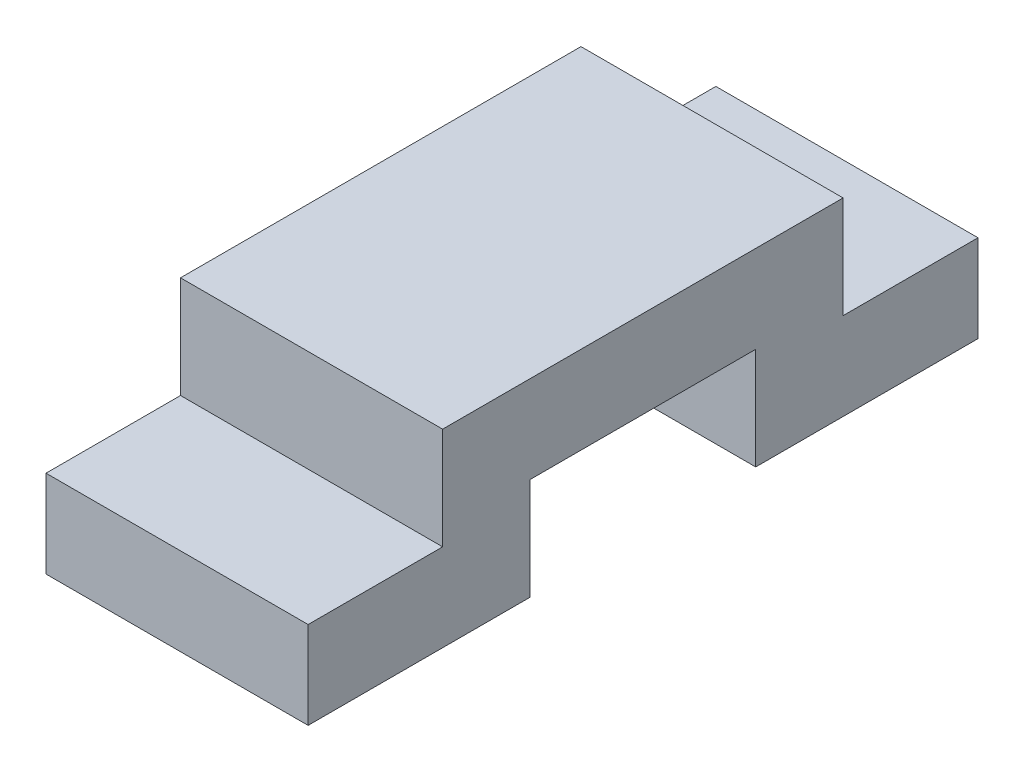
ISO-10303-21;
HEADER;
FILE_DESCRIPTION(('STEP AP214'),'2;1');
FILE_NAME('part.step','',(''),(''),'','','');
FILE_SCHEMA(('AUTOMOTIVE_DESIGN { 1 0 10303 214 1 1 1 1 }'));
ENDSEC;
DATA;
#1=APPLICATION_CONTEXT('core data for automotive mechanical design processes');
#2=APPLICATION_PROTOCOL_DEFINITION('international standard','automotive_design',2000,#1);
#3=PRODUCT_CONTEXT('',#1,'mechanical');
#4=PRODUCT('Part','Part','',(#3));
#5=PRODUCT_RELATED_PRODUCT_CATEGORY('part','',(#4));
#6=PRODUCT_DEFINITION_FORMATION('','',#4);
#7=PRODUCT_DEFINITION_CONTEXT('part definition',#1,'design');
#8=PRODUCT_DEFINITION('design','',#6,#7);
#9=PRODUCT_DEFINITION_SHAPE('','',#8);
#10=(LENGTH_UNIT() NAMED_UNIT(*) SI_UNIT(.MILLI.,.METRE.));
#11=(NAMED_UNIT(*) PLANE_ANGLE_UNIT() SI_UNIT($,.RADIAN.));
#12=(NAMED_UNIT(*) SI_UNIT($,.STERADIAN.) SOLID_ANGLE_UNIT());
#13=UNCERTAINTY_MEASURE_WITH_UNIT(LENGTH_MEASURE(1.E-05),#10,'distance_accuracy_value','');
#14=(GEOMETRIC_REPRESENTATION_CONTEXT(3) GLOBAL_UNCERTAINTY_ASSIGNED_CONTEXT((#13)) GLOBAL_UNIT_ASSIGNED_CONTEXT((#10,
#11,#12)) REPRESENTATION_CONTEXT('',''));
#15=CARTESIAN_POINT('',(0.,0.,0.));
#16=DIRECTION('',(0.,0.,1.));
#17=DIRECTION('',(1.,0.,0.));
#18=AXIS2_PLACEMENT_3D('',#15,#16,#17);
#19=CARTESIAN_POINT('',(0.,0.,0.));
#20=DIRECTION('',(0.,-1.,0.));
#21=DIRECTION('',(0.,0.,-1.));
#22=AXIS2_PLACEMENT_3D('',#19,#20,#21);
#23=PLANE('',#22);
#24=DIRECTION('',(0.,0.,-1.));
#25=VECTOR('',#24,1.);
#26=CARTESIAN_POINT('',(9.,0.,-0.2211828319911));
#27=LINE('',#26,#25);
#28=CARTESIAN_POINT('',(9.,0.,-15.5895922301704));
#29=VERTEX_POINT('',#28);
#30=CARTESIAN_POINT('',(9.,0.,-23.2211828319911));
#31=VERTEX_POINT('',#30);
#32=EDGE_CURVE('E232',#29,#31,#27,.T.);
#33=ORIENTED_EDGE('',*,*,#32,.F.);
#34=DIRECTION('',(-1.,0.,0.));
#35=VECTOR('',#34,1.);
#36=CARTESIAN_POINT('',(0.,0.,-15.5895922301704));
#37=LINE('',#36,#35);
#38=CARTESIAN_POINT('',(0.,0.,-15.5895922301704));
#39=VERTEX_POINT('',#38);
#40=EDGE_CURVE('E76',#29,#39,#37,.T.);
#41=ORIENTED_EDGE('',*,*,#40,.T.);
#42=DIRECTION('',(0.,0.,1.));
#43=VECTOR('',#42,1.);
#44=CARTESIAN_POINT('',(0.,0.,-0.2211828319911));
#45=LINE('',#44,#43);
#46=CARTESIAN_POINT('',(0.,0.,-23.2211828319911));
#47=VERTEX_POINT('',#46);
#48=EDGE_CURVE('E226',#47,#39,#45,.T.);
#49=ORIENTED_EDGE('',*,*,#48,.F.);
#50=DIRECTION('',(-1.,0.,0.));
#51=VECTOR('',#50,1.);
#52=CARTESIAN_POINT('',(0.,0.,-23.2211828319911));
#53=LINE('',#52,#51);
#54=EDGE_CURVE('E234',#31,#47,#53,.T.);
#55=ORIENTED_EDGE('',*,*,#54,.F.);
#56=EDGE_LOOP('',(#33,#41,#49,#55));
#57=FACE_BOUND('',#56,.T.);
#58=ADVANCED_FACE('F68',(#57),#23,.T.);
#59=CARTESIAN_POINT('',(0.,15.,-0.2211828319911));
#60=DIRECTION('',(1.,0.,0.));
#61=DIRECTION('',(0.,0.,-1.));
#62=AXIS2_PLACEMENT_3D('',#59,#60,#61);
#63=PLANE('',#62);
#64=DIRECTION('',(0.,0.,-1.));
#65=VECTOR('',#64,1.);
#66=CARTESIAN_POINT('',(0.,3.49999999999986,-0.2211828319911));
#67=LINE('',#66,#65);
#68=CARTESIAN_POINT('',(0.,3.49999999999986,-7.83959223017038));
#69=VERTEX_POINT('',#68);
#70=CARTESIAN_POINT('',(0.,3.49999999999986,-15.5895922301704));
#71=VERTEX_POINT('',#70);
#72=EDGE_CURVE('E185',#69,#71,#67,.T.);
#73=ORIENTED_EDGE('',*,*,#72,.F.);
#74=DIRECTION('',(0.,-1.,0.));
#75=VECTOR('',#74,1.);
#76=CARTESIAN_POINT('',(0.,15.,-7.83959223017038));
#77=LINE('',#76,#75);
#78=CARTESIAN_POINT('',(0.,0.,-7.83959223017038));
#79=VERTEX_POINT('',#78);
#80=EDGE_CURVE('E163',#69,#79,#77,.T.);
#81=ORIENTED_EDGE('',*,*,#80,.T.);
#82=CARTESIAN_POINT('',(0.,0.,-0.2211828319911));
#83=VERTEX_POINT('',#82);
#84=EDGE_CURVE('E225',#79,#83,#45,.T.);
#85=ORIENTED_EDGE('',*,*,#84,.T.);
#86=DIRECTION('',(0.,-1.,0.));
#87=VECTOR('',#86,1.);
#88=CARTESIAN_POINT('',(0.,15.,-0.2211828319911));
#89=LINE('',#88,#87);
#90=CARTESIAN_POINT('',(0.,2.99999999999999,-0.2211828319911));
#91=VERTEX_POINT('',#90);
#92=EDGE_CURVE('E244',#91,#83,#89,.T.);
#93=ORIENTED_EDGE('',*,*,#92,.F.);
#94=DIRECTION('',(0.,0.,-1.));
#95=VECTOR('',#94,1.);
#96=CARTESIAN_POINT('',(0.,2.99999999999999,-0.2211828319911));
#97=LINE('',#96,#95);
#98=CARTESIAN_POINT('',(0.,2.99999999999999,-4.83959223017038));
#99=VERTEX_POINT('',#98);
#100=EDGE_CURVE('E214',#91,#99,#97,.T.);
#101=ORIENTED_EDGE('',*,*,#100,.T.);
#102=DIRECTION('',(0.,1.,0.));
#103=VECTOR('',#102,1.);
#104=CARTESIAN_POINT('',(0.,15.,-4.83959223017038));
#105=LINE('',#104,#103);
#106=CARTESIAN_POINT('',(0.,6.49999999999986,-4.83959223017038));
#107=VERTEX_POINT('',#106);
#108=EDGE_CURVE('E217',#99,#107,#105,.T.);
#109=ORIENTED_EDGE('',*,*,#108,.T.);
#110=DIRECTION('',(0.,0.,-1.));
#111=VECTOR('',#110,1.);
#112=CARTESIAN_POINT('',(0.,6.49999999999986,-0.2211828319911));
#113=LINE('',#112,#111);
#114=CARTESIAN_POINT('',(0.,6.49999999999986,-18.5895922301704));
#115=VERTEX_POINT('',#114);
#116=EDGE_CURVE('E220',#107,#115,#113,.T.);
#117=ORIENTED_EDGE('',*,*,#116,.T.);
#118=DIRECTION('',(0.,1.,0.));
#119=VECTOR('',#118,1.);
#120=CARTESIAN_POINT('',(0.,15.,-18.5895922301704));
#121=LINE('',#120,#119);
#122=CARTESIAN_POINT('',(0.,2.99999999999999,-18.5895922301704));
#123=VERTEX_POINT('',#122);
#124=EDGE_CURVE('E223',#123,#115,#121,.T.);
#125=ORIENTED_EDGE('',*,*,#124,.F.);
#126=DIRECTION('',(0.,0.,-1.));
#127=VECTOR('',#126,1.);
#128=CARTESIAN_POINT('',(0.,2.99999999999999,-0.2211828319911));
#129=LINE('',#128,#127);
#130=CARTESIAN_POINT('',(0.,2.99999999999999,-23.2211828319911));
#131=VERTEX_POINT('',#130);
#132=EDGE_CURVE('E201',#123,#131,#129,.T.);
#133=ORIENTED_EDGE('',*,*,#132,.T.);
#134=DIRECTION('',(0.,-1.,0.));
#135=VECTOR('',#134,1.);
#136=CARTESIAN_POINT('',(0.,15.,-23.2211828319911));
#137=LINE('',#136,#135);
#138=EDGE_CURVE('E237',#131,#47,#137,.T.);
#139=ORIENTED_EDGE('',*,*,#138,.T.);
#140=ORIENTED_EDGE('',*,*,#48,.T.);
#141=DIRECTION('',(0.,-1.,0.));
#142=VECTOR('',#141,1.);
#143=CARTESIAN_POINT('',(0.,15.,-15.5895922301704));
#144=LINE('',#143,#142);
#145=EDGE_CURVE('E83',#71,#39,#144,.T.);
#146=ORIENTED_EDGE('',*,*,#145,.F.);
#147=EDGE_LOOP('',(#73,#81,#85,#93,#101,#109,#117,#125,#133,#139,#140,#146));
#148=FACE_BOUND('',#147,.T.);
#149=ADVANCED_FACE('F70',(#148),#63,.F.);
#150=CARTESIAN_POINT('',(0.,15.,-0.2211828319911));
#151=DIRECTION('',(0.,0.,-1.));
#152=DIRECTION('',(-1.,0.,0.));
#153=AXIS2_PLACEMENT_3D('',#150,#151,#152);
#154=PLANE('',#153);
#155=DIRECTION('',(0.,-1.,0.));
#156=VECTOR('',#155,1.);
#157=CARTESIAN_POINT('',(9.,15.,-0.2211828319911));
#158=LINE('',#157,#156);
#159=CARTESIAN_POINT('',(9.,2.99999999999999,-0.2211828319911));
#160=VERTEX_POINT('',#159);
#161=CARTESIAN_POINT('',(9.,0.,-0.2211828319911));
#162=VERTEX_POINT('',#161);
#163=EDGE_CURVE('E242',#160,#162,#158,.T.);
#164=ORIENTED_EDGE('',*,*,#163,.F.);
#165=DIRECTION('',(1.,0.,0.));
#166=VECTOR('',#165,1.);
#167=CARTESIAN_POINT('',(-6.,2.99999999999999,-0.2211828319911));
#168=LINE('',#167,#166);
#169=EDGE_CURVE('E210',#91,#160,#168,.T.);
#170=ORIENTED_EDGE('',*,*,#169,.F.);
#171=ORIENTED_EDGE('',*,*,#92,.T.);
#172=DIRECTION('',(1.,0.,0.));
#173=VECTOR('',#172,1.);
#174=CARTESIAN_POINT('',(0.,0.,-0.2211828319911));
#175=LINE('',#174,#173);
#176=EDGE_CURVE('E229',#83,#162,#175,.T.);
#177=ORIENTED_EDGE('',*,*,#176,.T.);
#178=EDGE_LOOP('',(#164,#170,#171,#177));
#179=FACE_BOUND('',#178,.T.);
#180=ADVANCED_FACE('F271',(#179),#154,.F.);
#181=CARTESIAN_POINT('',(9.,15.,-0.2211828319911));
#182=DIRECTION('',(-1.,0.,0.));
#183=DIRECTION('',(0.,0.,1.));
#184=AXIS2_PLACEMENT_3D('',#181,#182,#183);
#185=PLANE('',#184);
#186=CARTESIAN_POINT('',(9.,0.,-7.83959223017038));
#187=VERTEX_POINT('',#186);
#188=EDGE_CURVE('E179',#162,#187,#27,.T.);
#189=ORIENTED_EDGE('',*,*,#188,.T.);
#190=DIRECTION('',(0.,-1.,0.));
#191=VECTOR('',#190,1.);
#192=CARTESIAN_POINT('',(9.,3.49999999999986,-7.83959223017038));
#193=LINE('',#192,#191);
#194=CARTESIAN_POINT('',(9.,3.49999999999986,-7.83959223017038));
#195=VERTEX_POINT('',#194);
#196=EDGE_CURVE('E160',#195,#187,#193,.T.);
#197=ORIENTED_EDGE('',*,*,#196,.F.);
#198=DIRECTION('',(0.,0.,-1.));
#199=VECTOR('',#198,1.);
#200=CARTESIAN_POINT('',(9.,3.49999999999986,-7.83959223017038));
#201=LINE('',#200,#199);
#202=CARTESIAN_POINT('',(9.,3.49999999999986,-15.5895922301704));
#203=VERTEX_POINT('',#202);
#204=EDGE_CURVE('E169',#195,#203,#201,.T.);
#205=ORIENTED_EDGE('',*,*,#204,.T.);
#206=DIRECTION('',(0.,-1.,0.));
#207=VECTOR('',#206,1.);
#208=CARTESIAN_POINT('',(9.,3.49999999999986,-15.5895922301704));
#209=LINE('',#208,#207);
#210=EDGE_CURVE('E174',#203,#29,#209,.T.);
#211=ORIENTED_EDGE('',*,*,#210,.T.);
#212=ORIENTED_EDGE('',*,*,#32,.T.);
#213=DIRECTION('',(0.,-1.,0.));
#214=VECTOR('',#213,1.);
#215=CARTESIAN_POINT('',(9.,15.,-23.2211828319911));
#216=LINE('',#215,#214);
#217=CARTESIAN_POINT('',(9.,2.99999999999999,-23.2211828319911));
#218=VERTEX_POINT('',#217);
#219=EDGE_CURVE('E239',#218,#31,#216,.T.);
#220=ORIENTED_EDGE('',*,*,#219,.F.);
#221=DIRECTION('',(0.,0.,-1.));
#222=VECTOR('',#221,1.);
#223=CARTESIAN_POINT('',(9.,2.99999999999999,0.));
#224=LINE('',#223,#222);
#225=CARTESIAN_POINT('',(9.,2.99999999999999,-18.5895922301704));
#226=VERTEX_POINT('',#225);
#227=EDGE_CURVE('E91',#226,#218,#224,.T.);
#228=ORIENTED_EDGE('',*,*,#227,.F.);
#229=DIRECTION('',(0.,1.,0.));
#230=VECTOR('',#229,1.);
#231=CARTESIAN_POINT('',(9.,0.,-18.5895922301704));
#232=LINE('',#231,#230);
#233=CARTESIAN_POINT('',(9.,6.49999999999986,-18.5895922301704));
#234=VERTEX_POINT('',#233);
#235=EDGE_CURVE('E196',#226,#234,#232,.T.);
#236=ORIENTED_EDGE('',*,*,#235,.T.);
#237=DIRECTION('',(0.,0.,-1.));
#238=VECTOR('',#237,1.);
#239=CARTESIAN_POINT('',(9.,6.49999999999986,0.));
#240=LINE('',#239,#238);
#241=CARTESIAN_POINT('',(9.,6.49999999999986,-4.83959223017038));
#242=VERTEX_POINT('',#241);
#243=EDGE_CURVE('E193',#242,#234,#240,.T.);
#244=ORIENTED_EDGE('',*,*,#243,.F.);
#245=DIRECTION('',(0.,1.,0.));
#246=VECTOR('',#245,1.);
#247=CARTESIAN_POINT('',(9.,0.,-4.83959223017038));
#248=LINE('',#247,#246);
#249=CARTESIAN_POINT('',(9.,2.99999999999999,-4.83959223017038));
#250=VERTEX_POINT('',#249);
#251=EDGE_CURVE('E190',#250,#242,#248,.T.);
#252=ORIENTED_EDGE('',*,*,#251,.F.);
#253=EDGE_CURVE('E187',#160,#250,#224,.T.);
#254=ORIENTED_EDGE('',*,*,#253,.F.);
#255=ORIENTED_EDGE('',*,*,#163,.T.);
#256=EDGE_LOOP('',(#189,#197,#205,#211,#212,#220,#228,#236,#244,#252,#254,#255));
#257=FACE_BOUND('',#256,.T.);
#258=ADVANCED_FACE('F177',(#257),#185,.F.);
#259=CARTESIAN_POINT('',(0.,15.,-23.2211828319911));
#260=DIRECTION('',(0.,0.,1.));
#261=DIRECTION('',(1.,0.,0.));
#262=AXIS2_PLACEMENT_3D('',#259,#260,#261);
#263=PLANE('',#262);
#264=ORIENTED_EDGE('',*,*,#138,.F.);
#265=DIRECTION('',(1.,0.,0.));
#266=VECTOR('',#265,1.);
#267=CARTESIAN_POINT('',(-6.,2.99999999999999,-23.2211828319911));
#268=LINE('',#267,#266);
#269=EDGE_CURVE('E199',#131,#218,#268,.T.);
#270=ORIENTED_EDGE('',*,*,#269,.T.);
#271=ORIENTED_EDGE('',*,*,#219,.T.);
#272=ORIENTED_EDGE('',*,*,#54,.T.);
#273=EDGE_LOOP('',(#264,#270,#271,#272));
#274=FACE_BOUND('',#273,.T.);
#275=ADVANCED_FACE('F254',(#274),#263,.F.);
#276=DIRECTION('',(-1.,0.,0.));
#277=VECTOR('',#276,1.);
#278=CARTESIAN_POINT('',(0.,0.,-7.83959223017038));
#279=LINE('',#278,#277);
#280=EDGE_CURVE('E12',#187,#79,#279,.T.);
#281=ORIENTED_EDGE('',*,*,#280,.F.);
#282=ORIENTED_EDGE('',*,*,#188,.F.);
#283=ORIENTED_EDGE('',*,*,#176,.F.);
#284=ORIENTED_EDGE('',*,*,#84,.F.);
#285=EDGE_LOOP('',(#281,#282,#283,#284));
#286=FACE_BOUND('',#285,.T.);
#287=ADVANCED_FACE('F267',(#286),#23,.T.);
#288=CARTESIAN_POINT('',(-6.,0.,-18.5895922301704));
#289=DIRECTION('',(0.,0.,-1.));
#290=DIRECTION('',(-1.,0.,0.));
#291=AXIS2_PLACEMENT_3D('',#288,#289,#290);
#292=PLANE('',#291);
#293=ORIENTED_EDGE('',*,*,#124,.T.);
#294=DIRECTION('',(1.,0.,0.));
#295=VECTOR('',#294,1.);
#296=CARTESIAN_POINT('',(-6.,6.49999999999986,-18.5895922301704));
#297=LINE('',#296,#295);
#298=EDGE_CURVE('E204',#115,#234,#297,.T.);
#299=ORIENTED_EDGE('',*,*,#298,.T.);
#300=ORIENTED_EDGE('',*,*,#235,.F.);
#301=DIRECTION('',(1.,0.,0.));
#302=VECTOR('',#301,1.);
#303=CARTESIAN_POINT('',(-6.,2.99999999999999,-18.5895922301704));
#304=LINE('',#303,#302);
#305=EDGE_CURVE('E202',#123,#226,#304,.T.);
#306=ORIENTED_EDGE('',*,*,#305,.F.);
#307=EDGE_LOOP('',(#293,#299,#300,#306));
#308=FACE_BOUND('',#307,.T.);
#309=ADVANCED_FACE('F275',(#308),#292,.T.);
#310=CARTESIAN_POINT('',(-6.,6.49999999999986,0.));
#311=DIRECTION('',(0.,-1.,0.));
#312=DIRECTION('',(0.,0.,-1.));
#313=AXIS2_PLACEMENT_3D('',#310,#311,#312);
#314=PLANE('',#313);
#315=DIRECTION('',(1.,0.,0.));
#316=VECTOR('',#315,1.);
#317=CARTESIAN_POINT('',(-6.,6.49999999999986,-4.83959223017038));
#318=LINE('',#317,#316);
#319=EDGE_CURVE('E206',#107,#242,#318,.T.);
#320=ORIENTED_EDGE('',*,*,#319,.T.);
#321=ORIENTED_EDGE('',*,*,#243,.T.);
#322=ORIENTED_EDGE('',*,*,#298,.F.);
#323=ORIENTED_EDGE('',*,*,#116,.F.);
#324=EDGE_LOOP('',(#320,#321,#322,#323));
#325=FACE_BOUND('',#324,.T.);
#326=ADVANCED_FACE('F282',(#325),#314,.F.);
#327=CARTESIAN_POINT('',(-6.,0.,-4.83959223017038));
#328=DIRECTION('',(0.,0.,-1.));
#329=DIRECTION('',(-1.,0.,0.));
#330=AXIS2_PLACEMENT_3D('',#327,#328,#329);
#331=PLANE('',#330);
#332=DIRECTION('',(1.,0.,0.));
#333=VECTOR('',#332,1.);
#334=CARTESIAN_POINT('',(-6.,2.99999999999999,-4.83959223017038));
#335=LINE('',#334,#333);
#336=EDGE_CURVE('E208',#99,#250,#335,.T.);
#337=ORIENTED_EDGE('',*,*,#336,.T.);
#338=ORIENTED_EDGE('',*,*,#251,.T.);
#339=ORIENTED_EDGE('',*,*,#319,.F.);
#340=ORIENTED_EDGE('',*,*,#108,.F.);
#341=EDGE_LOOP('',(#337,#338,#339,#340));
#342=FACE_BOUND('',#341,.T.);
#343=ADVANCED_FACE('F299',(#342),#331,.F.);
#344=CARTESIAN_POINT('',(-6.,2.99999999999999,0.));
#345=DIRECTION('',(0.,-1.,0.));
#346=DIRECTION('',(0.,0.,-1.));
#347=AXIS2_PLACEMENT_3D('',#344,#345,#346);
#348=PLANE('',#347);
#349=ORIENTED_EDGE('',*,*,#169,.T.);
#350=ORIENTED_EDGE('',*,*,#253,.T.);
#351=ORIENTED_EDGE('',*,*,#336,.F.);
#352=ORIENTED_EDGE('',*,*,#100,.F.);
#353=EDGE_LOOP('',(#349,#350,#351,#352));
#354=FACE_BOUND('',#353,.T.);
#355=ADVANCED_FACE('F293',(#354),#348,.F.);
#356=ORIENTED_EDGE('',*,*,#305,.T.);
#357=ORIENTED_EDGE('',*,*,#227,.T.);
#358=ORIENTED_EDGE('',*,*,#269,.F.);
#359=ORIENTED_EDGE('',*,*,#132,.F.);
#360=EDGE_LOOP('',(#356,#357,#358,#359));
#361=FACE_BOUND('',#360,.T.);
#362=ADVANCED_FACE('F304',(#361),#348,.F.);
#363=CARTESIAN_POINT('',(-6.,3.49999999999986,-7.83959223017038));
#364=DIRECTION('',(0.,-1.,0.));
#365=DIRECTION('',(0.,0.,-1.));
#366=AXIS2_PLACEMENT_3D('',#363,#364,#365);
#367=PLANE('',#366);
#368=ORIENTED_EDGE('',*,*,#72,.T.);
#369=DIRECTION('',(1.,0.,0.));
#370=VECTOR('',#369,1.);
#371=CARTESIAN_POINT('',(-6.,3.49999999999986,-15.5895922301704));
#372=LINE('',#371,#370);
#373=EDGE_CURVE('E166',#71,#203,#372,.T.);
#374=ORIENTED_EDGE('',*,*,#373,.T.);
#375=ORIENTED_EDGE('',*,*,#204,.F.);
#376=DIRECTION('',(1.,0.,0.));
#377=VECTOR('',#376,1.);
#378=CARTESIAN_POINT('',(-6.,3.49999999999986,-7.83959223017038));
#379=LINE('',#378,#377);
#380=EDGE_CURVE('E156',#69,#195,#379,.T.);
#381=ORIENTED_EDGE('',*,*,#380,.F.);
#382=EDGE_LOOP('',(#368,#374,#375,#381));
#383=FACE_BOUND('',#382,.T.);
#384=ADVANCED_FACE('F170',(#383),#367,.T.);
#385=CARTESIAN_POINT('',(-6.,3.49999999999986,-7.83959223017038));
#386=DIRECTION('',(0.,0.,1.));
#387=DIRECTION('',(1.,0.,0.));
#388=AXIS2_PLACEMENT_3D('',#385,#386,#387);
#389=PLANE('',#388);
#390=ORIENTED_EDGE('',*,*,#380,.T.);
#391=ORIENTED_EDGE('',*,*,#196,.T.);
#392=ORIENTED_EDGE('',*,*,#280,.T.);
#393=ORIENTED_EDGE('',*,*,#80,.F.);
#394=EDGE_LOOP('',(#390,#391,#392,#393));
#395=FACE_BOUND('',#394,.T.);
#396=ADVANCED_FACE('F158',(#395),#389,.F.);
#397=CARTESIAN_POINT('',(-6.,3.49999999999986,-15.5895922301704));
#398=DIRECTION('',(0.,0.,1.));
#399=DIRECTION('',(1.,0.,0.));
#400=AXIS2_PLACEMENT_3D('',#397,#398,#399);
#401=PLANE('',#400);
#402=ORIENTED_EDGE('',*,*,#145,.T.);
#403=ORIENTED_EDGE('',*,*,#40,.F.);
#404=ORIENTED_EDGE('',*,*,#210,.F.);
#405=ORIENTED_EDGE('',*,*,#373,.F.);
#406=EDGE_LOOP('',(#402,#403,#404,#405));
#407=FACE_BOUND('',#406,.T.);
#408=ADVANCED_FACE('F256',(#407),#401,.T.);
#409=CLOSED_SHELL('',(#58,#149,#180,#258,#275,#287,#309,#326,#343,#355,#362,#384,#396,#408));
#410=MANIFOLD_SOLID_BREP('B2',#409);
#411=ADVANCED_BREP_SHAPE_REPRESENTATION('',(#18,#410),#14);
#412=SHAPE_DEFINITION_REPRESENTATION(#9,#411);
ENDSEC;
END-ISO-10303-21;
